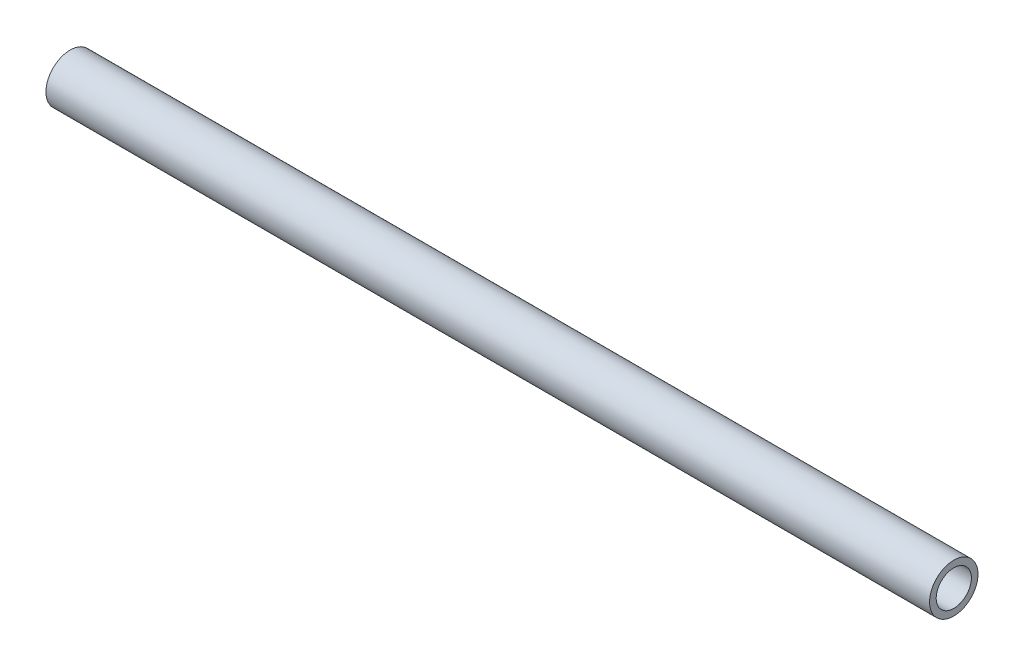
ISO-10303-21;
HEADER;
FILE_DESCRIPTION(('STEP AP214'),'2;1');
FILE_NAME('part.step','',(''),(''),'','','');
FILE_SCHEMA(('AUTOMOTIVE_DESIGN { 1 0 10303 214 1 1 1 1 }'));
ENDSEC;
DATA;
#1=APPLICATION_CONTEXT('core data for automotive mechanical design processes');
#2=APPLICATION_PROTOCOL_DEFINITION('international standard','automotive_design',2000,#1);
#3=PRODUCT_CONTEXT('',#1,'mechanical');
#4=PRODUCT('Part','Part','',(#3));
#5=PRODUCT_RELATED_PRODUCT_CATEGORY('part','',(#4));
#6=PRODUCT_DEFINITION_FORMATION('','',#4);
#7=PRODUCT_DEFINITION_CONTEXT('part definition',#1,'design');
#8=PRODUCT_DEFINITION('design','',#6,#7);
#9=PRODUCT_DEFINITION_SHAPE('','',#8);
#10=(LENGTH_UNIT() NAMED_UNIT(*) SI_UNIT(.MILLI.,.METRE.));
#11=(NAMED_UNIT(*) PLANE_ANGLE_UNIT() SI_UNIT($,.RADIAN.));
#12=(NAMED_UNIT(*) SI_UNIT($,.STERADIAN.) SOLID_ANGLE_UNIT());
#13=UNCERTAINTY_MEASURE_WITH_UNIT(LENGTH_MEASURE(1.E-05),#10,'distance_accuracy_value','');
#14=(GEOMETRIC_REPRESENTATION_CONTEXT(3) GLOBAL_UNCERTAINTY_ASSIGNED_CONTEXT((#13)) GLOBAL_UNIT_ASSIGNED_CONTEXT((#10,
#11,#12)) REPRESENTATION_CONTEXT('',''));
#15=CARTESIAN_POINT('',(0.,0.,0.));
#16=DIRECTION('',(0.,0.,1.));
#17=DIRECTION('',(1.,0.,0.));
#18=AXIS2_PLACEMENT_3D('',#15,#16,#17);
#19=CARTESIAN_POINT('',(480.,0.,0.));
#20=DIRECTION('',(1.,0.,0.));
#21=DIRECTION('',(0.,0.,-1.));
#22=AXIS2_PLACEMENT_3D('',#19,#20,#21);
#23=PLANE('',#22);
#24=CARTESIAN_POINT('',(480.,0.,0.));
#25=DIRECTION('',(1.,0.,0.));
#26=DIRECTION('',(0.,0.,-1.));
#27=AXIS2_PLACEMENT_3D('',#24,#25,#26);
#28=CIRCLE('',#27,13.15);
#29=CARTESIAN_POINT('',(480.,0.,-13.15));
#30=VERTEX_POINT('',#29);
#31=EDGE_CURVE('E10',#30,#30,#28,.T.);
#32=ORIENTED_EDGE('',*,*,#31,.T.);
#33=EDGE_LOOP('',(#32));
#34=FACE_BOUND('',#33,.T.);
#35=CARTESIAN_POINT('',(480.,0.,0.));
#36=DIRECTION('',(1.,0.,0.));
#37=DIRECTION('',(0.,0.,-1.));
#38=AXIS2_PLACEMENT_3D('',#35,#36,#37);
#39=CIRCLE('',#38,9.55);
#40=CARTESIAN_POINT('',(480.,0.,-9.55));
#41=VERTEX_POINT('',#40);
#42=EDGE_CURVE('E44',#41,#41,#39,.T.);
#43=ORIENTED_EDGE('',*,*,#42,.F.);
#44=EDGE_LOOP('',(#43));
#45=FACE_BOUND('',#44,.T.);
#46=ADVANCED_FACE('F33',(#34,#45),#23,.T.);
#47=CARTESIAN_POINT('',(0.,0.,0.));
#48=DIRECTION('',(1.,0.,0.));
#49=DIRECTION('',(0.,0.,-1.));
#50=AXIS2_PLACEMENT_3D('',#47,#48,#49);
#51=PLANE('',#50);
#52=CARTESIAN_POINT('',(0.,0.,0.));
#53=DIRECTION('',(1.,0.,0.));
#54=DIRECTION('',(0.,0.,-1.));
#55=AXIS2_PLACEMENT_3D('',#52,#53,#54);
#56=CIRCLE('',#55,13.15);
#57=CARTESIAN_POINT('',(0.,0.,-13.15));
#58=VERTEX_POINT('',#57);
#59=EDGE_CURVE('E37',#58,#58,#56,.T.);
#60=ORIENTED_EDGE('',*,*,#59,.F.);
#61=EDGE_LOOP('',(#60));
#62=FACE_BOUND('',#61,.T.);
#63=CARTESIAN_POINT('',(0.,0.,0.));
#64=DIRECTION('',(1.,0.,0.));
#65=DIRECTION('',(0.,0.,-1.));
#66=AXIS2_PLACEMENT_3D('',#63,#64,#65);
#67=CIRCLE('',#66,9.55);
#68=CARTESIAN_POINT('',(0.,0.,-9.55));
#69=VERTEX_POINT('',#68);
#70=EDGE_CURVE('E46',#69,#69,#67,.T.);
#71=ORIENTED_EDGE('',*,*,#70,.T.);
#72=EDGE_LOOP('',(#71));
#73=FACE_BOUND('',#72,.T.);
#74=ADVANCED_FACE('F56',(#62,#73),#51,.F.);
#75=CARTESIAN_POINT('',(480.,0.,0.));
#76=DIRECTION('',(-1.,0.,0.));
#77=DIRECTION('',(0.,0.,1.));
#78=AXIS2_PLACEMENT_3D('',#75,#76,#77);
#79=CYLINDRICAL_SURFACE('',#78,13.15);
#80=ORIENTED_EDGE('',*,*,#31,.F.);
#81=EDGE_LOOP('',(#80));
#82=FACE_BOUND('',#81,.T.);
#83=ORIENTED_EDGE('',*,*,#59,.T.);
#84=EDGE_LOOP('',(#83));
#85=FACE_BOUND('',#84,.T.);
#86=ADVANCED_FACE('F35',(#82,#85),#79,.T.);
#87=CARTESIAN_POINT('',(480.,0.,0.));
#88=DIRECTION('',(-1.,0.,0.));
#89=DIRECTION('',(0.,0.,1.));
#90=AXIS2_PLACEMENT_3D('',#87,#88,#89);
#91=CYLINDRICAL_SURFACE('',#90,9.55);
#92=ORIENTED_EDGE('',*,*,#42,.T.);
#93=EDGE_LOOP('',(#92));
#94=FACE_BOUND('',#93,.T.);
#95=ORIENTED_EDGE('',*,*,#70,.F.);
#96=EDGE_LOOP('',(#95));
#97=FACE_BOUND('',#96,.T.);
#98=ADVANCED_FACE('F52',(#94,#97),#91,.F.);
#99=CLOSED_SHELL('',(#46,#74,#86,#98));
#100=MANIFOLD_SOLID_BREP('B2',#99);
#101=ADVANCED_BREP_SHAPE_REPRESENTATION('',(#18,#100),#14);
#102=SHAPE_DEFINITION_REPRESENTATION(#9,#101);
ENDSEC;
END-ISO-10303-21;
